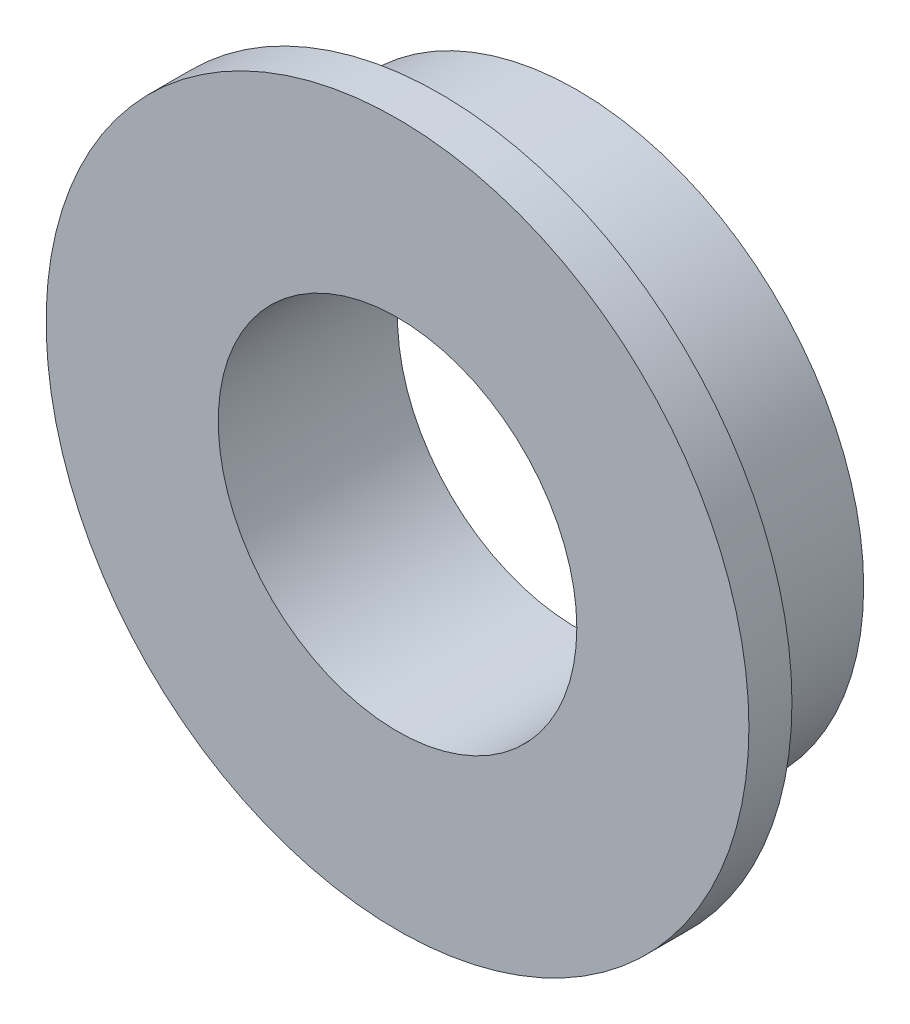
ISO-10303-21;
HEADER;
FILE_DESCRIPTION(('STEP AP214'),'2;1');
FILE_NAME('part.step','',(''),(''),'','','');
FILE_SCHEMA(('AUTOMOTIVE_DESIGN { 1 0 10303 214 1 1 1 1 }'));
ENDSEC;
DATA;
#1=APPLICATION_CONTEXT('core data for automotive mechanical design processes');
#2=APPLICATION_PROTOCOL_DEFINITION('international standard','automotive_design',2000,#1);
#3=PRODUCT_CONTEXT('',#1,'mechanical');
#4=PRODUCT('Part','Part','',(#3));
#5=PRODUCT_RELATED_PRODUCT_CATEGORY('part','',(#4));
#6=PRODUCT_DEFINITION_FORMATION('','',#4);
#7=PRODUCT_DEFINITION_CONTEXT('part definition',#1,'design');
#8=PRODUCT_DEFINITION('design','',#6,#7);
#9=PRODUCT_DEFINITION_SHAPE('','',#8);
#10=(LENGTH_UNIT() NAMED_UNIT(*) SI_UNIT(.MILLI.,.METRE.));
#11=(NAMED_UNIT(*) PLANE_ANGLE_UNIT() SI_UNIT($,.RADIAN.));
#12=(NAMED_UNIT(*) SI_UNIT($,.STERADIAN.) SOLID_ANGLE_UNIT());
#13=UNCERTAINTY_MEASURE_WITH_UNIT(LENGTH_MEASURE(1.E-05),#10,'distance_accuracy_value','');
#14=(GEOMETRIC_REPRESENTATION_CONTEXT(3) GLOBAL_UNCERTAINTY_ASSIGNED_CONTEXT((#13)) GLOBAL_UNIT_ASSIGNED_CONTEXT((#10,
#11,#12)) REPRESENTATION_CONTEXT('',''));
#15=CARTESIAN_POINT('',(0.,0.,0.));
#16=DIRECTION('',(0.,0.,1.));
#17=DIRECTION('',(1.,0.,0.));
#18=AXIS2_PLACEMENT_3D('',#15,#16,#17);
#19=CARTESIAN_POINT('',(0.,0.,2.5));
#20=DIRECTION('',(0.,0.,-1.));
#21=DIRECTION('',(-1.,0.,0.));
#22=AXIS2_PLACEMENT_3D('',#19,#20,#21);
#23=CYLINDRICAL_SURFACE('',#22,4.);
#24=CARTESIAN_POINT('',(0.,0.,0.));
#25=DIRECTION('',(0.,0.,1.));
#26=DIRECTION('',(1.,0.,0.));
#27=AXIS2_PLACEMENT_3D('',#24,#25,#26);
#28=CIRCLE('',#27,4.);
#29=CARTESIAN_POINT('',(4.,0.,0.));
#30=VERTEX_POINT('',#29);
#31=EDGE_CURVE('E50',#30,#30,#28,.T.);
#32=ORIENTED_EDGE('',*,*,#31,.T.);
#33=EDGE_LOOP('',(#32));
#34=FACE_BOUND('',#33,.T.);
#35=CARTESIAN_POINT('',(0.,0.,1.9));
#36=DIRECTION('',(0.,0.,1.));
#37=DIRECTION('',(1.,0.,0.));
#38=AXIS2_PLACEMENT_3D('',#35,#36,#37);
#39=CIRCLE('',#38,4.);
#40=CARTESIAN_POINT('',(4.,0.,1.9));
#41=VERTEX_POINT('',#40);
#42=EDGE_CURVE('E10',#41,#41,#39,.T.);
#43=ORIENTED_EDGE('',*,*,#42,.F.);
#44=EDGE_LOOP('',(#43));
#45=FACE_BOUND('',#44,.T.);
#46=ADVANCED_FACE('F43',(#34,#45),#23,.T.);
#47=CARTESIAN_POINT('',(0.,0.,2.5));
#48=DIRECTION('',(0.,0.,1.));
#49=DIRECTION('',(1.,0.,0.));
#50=AXIS2_PLACEMENT_3D('',#47,#48,#49);
#51=PLANE('',#50);
#52=CARTESIAN_POINT('',(0.,0.,2.5));
#53=DIRECTION('',(0.,0.,1.));
#54=DIRECTION('',(1.,0.,0.));
#55=AXIS2_PLACEMENT_3D('',#52,#53,#54);
#56=CIRCLE('',#55,2.5);
#57=CARTESIAN_POINT('',(2.5,0.,2.5));
#58=VERTEX_POINT('',#57);
#59=EDGE_CURVE('E55',#58,#58,#56,.T.);
#60=ORIENTED_EDGE('',*,*,#59,.F.);
#61=EDGE_LOOP('',(#60));
#62=FACE_BOUND('',#61,.T.);
#63=CARTESIAN_POINT('',(0.,0.,2.5));
#64=DIRECTION('',(0.,0.,1.));
#65=DIRECTION('',(1.,0.,0.));
#66=AXIS2_PLACEMENT_3D('',#63,#64,#65);
#67=CIRCLE('',#66,4.9);
#68=CARTESIAN_POINT('',(4.9,0.,2.5));
#69=VERTEX_POINT('',#68);
#70=EDGE_CURVE('E67',#69,#69,#67,.T.);
#71=ORIENTED_EDGE('',*,*,#70,.T.);
#72=EDGE_LOOP('',(#71));
#73=FACE_BOUND('',#72,.T.);
#74=ADVANCED_FACE('F87',(#62,#73),#51,.T.);
#75=CARTESIAN_POINT('',(0.,0.,0.));
#76=DIRECTION('',(0.,0.,1.));
#77=DIRECTION('',(1.,0.,0.));
#78=AXIS2_PLACEMENT_3D('',#75,#76,#77);
#79=PLANE('',#78);
#80=ORIENTED_EDGE('',*,*,#31,.F.);
#81=EDGE_LOOP('',(#80));
#82=FACE_BOUND('',#81,.T.);
#83=CARTESIAN_POINT('',(0.,0.,0.));
#84=DIRECTION('',(0.,0.,1.));
#85=DIRECTION('',(1.,0.,0.));
#86=AXIS2_PLACEMENT_3D('',#83,#84,#85);
#87=CIRCLE('',#86,2.5);
#88=CARTESIAN_POINT('',(2.5,0.,0.));
#89=VERTEX_POINT('',#88);
#90=EDGE_CURVE('E60',#89,#89,#87,.T.);
#91=ORIENTED_EDGE('',*,*,#90,.T.);
#92=EDGE_LOOP('',(#91));
#93=FACE_BOUND('',#92,.T.);
#94=ADVANCED_FACE('F92',(#82,#93),#79,.F.);
#95=CARTESIAN_POINT('',(0.,0.,2.5));
#96=DIRECTION('',(0.,0.,-1.));
#97=DIRECTION('',(-1.,0.,0.));
#98=AXIS2_PLACEMENT_3D('',#95,#96,#97);
#99=CYLINDRICAL_SURFACE('',#98,2.5);
#100=ORIENTED_EDGE('',*,*,#59,.T.);
#101=EDGE_LOOP('',(#100));
#102=FACE_BOUND('',#101,.T.);
#103=ORIENTED_EDGE('',*,*,#90,.F.);
#104=EDGE_LOOP('',(#103));
#105=FACE_BOUND('',#104,.T.);
#106=ADVANCED_FACE('F84',(#102,#105),#99,.F.);
#107=CARTESIAN_POINT('',(0.,0.,1.9));
#108=DIRECTION('',(0.,0.,1.));
#109=DIRECTION('',(1.,0.,0.));
#110=AXIS2_PLACEMENT_3D('',#107,#108,#109);
#111=CYLINDRICAL_SURFACE('',#110,4.9);
#112=CARTESIAN_POINT('',(0.,0.,1.9));
#113=DIRECTION('',(0.,0.,1.));
#114=DIRECTION('',(1.,0.,0.));
#115=AXIS2_PLACEMENT_3D('',#112,#113,#114);
#116=CIRCLE('',#115,4.9);
#117=CARTESIAN_POINT('',(4.9,0.,1.9));
#118=VERTEX_POINT('',#117);
#119=EDGE_CURVE('E65',#118,#118,#116,.T.);
#120=ORIENTED_EDGE('',*,*,#119,.T.);
#121=EDGE_LOOP('',(#120));
#122=FACE_BOUND('',#121,.T.);
#123=ORIENTED_EDGE('',*,*,#70,.F.);
#124=EDGE_LOOP('',(#123));
#125=FACE_BOUND('',#124,.T.);
#126=ADVANCED_FACE('F75',(#122,#125),#111,.T.);
#127=CARTESIAN_POINT('',(0.,0.,1.9));
#128=DIRECTION('',(0.,0.,1.));
#129=DIRECTION('',(1.,0.,0.));
#130=AXIS2_PLACEMENT_3D('',#127,#128,#129);
#131=PLANE('',#130);
#132=ORIENTED_EDGE('',*,*,#42,.T.);
#133=EDGE_LOOP('',(#132));
#134=FACE_BOUND('',#133,.T.);
#135=ORIENTED_EDGE('',*,*,#119,.F.);
#136=EDGE_LOOP('',(#135));
#137=FACE_BOUND('',#136,.T.);
#138=ADVANCED_FACE('F78',(#134,#137),#131,.F.);
#139=CLOSED_SHELL('',(#46,#74,#94,#106,#126,#138));
#140=MANIFOLD_SOLID_BREP('B2',#139);
#141=ADVANCED_BREP_SHAPE_REPRESENTATION('',(#18,#140),#14);
#142=SHAPE_DEFINITION_REPRESENTATION(#9,#141);
ENDSEC;
END-ISO-10303-21;
